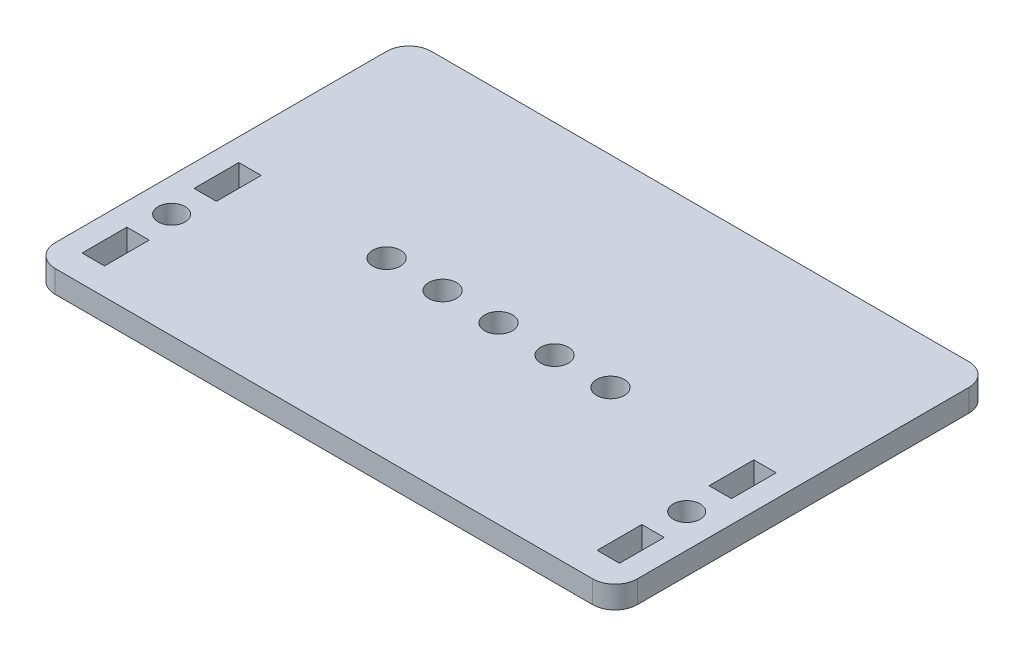
ISO-10303-21;
HEADER;
FILE_DESCRIPTION(('STEP AP214'),'2;1');
FILE_NAME('part.step','',(''),(''),'','','');
FILE_SCHEMA(('AUTOMOTIVE_DESIGN { 1 0 10303 214 1 1 1 1 }'));
ENDSEC;
DATA;
#1=APPLICATION_CONTEXT('core data for automotive mechanical design processes');
#2=APPLICATION_PROTOCOL_DEFINITION('international standard','automotive_design',2000,#1);
#3=PRODUCT_CONTEXT('',#1,'mechanical');
#4=PRODUCT('Part','Part','',(#3));
#5=PRODUCT_RELATED_PRODUCT_CATEGORY('part','',(#4));
#6=PRODUCT_DEFINITION_FORMATION('','',#4);
#7=PRODUCT_DEFINITION_CONTEXT('part definition',#1,'design');
#8=PRODUCT_DEFINITION('design','',#6,#7);
#9=PRODUCT_DEFINITION_SHAPE('','',#8);
#10=(LENGTH_UNIT() NAMED_UNIT(*) SI_UNIT(.MILLI.,.METRE.));
#11=(NAMED_UNIT(*) PLANE_ANGLE_UNIT() SI_UNIT($,.RADIAN.));
#12=(NAMED_UNIT(*) SI_UNIT($,.STERADIAN.) SOLID_ANGLE_UNIT());
#13=UNCERTAINTY_MEASURE_WITH_UNIT(LENGTH_MEASURE(1.E-05),#10,'distance_accuracy_value','');
#14=(GEOMETRIC_REPRESENTATION_CONTEXT(3) GLOBAL_UNCERTAINTY_ASSIGNED_CONTEXT((#13)) GLOBAL_UNIT_ASSIGNED_CONTEXT((#10,
#11,#12)) REPRESENTATION_CONTEXT('',''));
#15=CARTESIAN_POINT('',(0.,0.,0.));
#16=DIRECTION('',(0.,0.,1.));
#17=DIRECTION('',(1.,0.,0.));
#18=AXIS2_PLACEMENT_3D('',#15,#16,#17);
#19=CARTESIAN_POINT('',(65.,5.,-26.));
#20=DIRECTION('',(-1.,0.,0.));
#21=DIRECTION('',(0.,0.,1.));
#22=AXIS2_PLACEMENT_3D('',#19,#20,#21);
#23=PLANE('',#22);
#24=DIRECTION('',(0.,0.,-1.));
#25=VECTOR('',#24,1.);
#26=CARTESIAN_POINT('',(65.,0.,-26.));
#27=LINE('',#26,#25);
#28=CARTESIAN_POINT('',(65.,0.,21.));
#29=VERTEX_POINT('',#28);
#30=CARTESIAN_POINT('',(65.,0.,-53.));
#31=VERTEX_POINT('',#30);
#32=EDGE_CURVE('E306',#29,#31,#27,.T.);
#33=ORIENTED_EDGE('',*,*,#32,.T.);
#34=DIRECTION('',(0.,-1.,0.));
#35=VECTOR('',#34,1.);
#36=CARTESIAN_POINT('',(65.,5.,-53.));
#37=LINE('',#36,#35);
#38=CARTESIAN_POINT('',(65.,5.,-53.));
#39=VERTEX_POINT('',#38);
#40=EDGE_CURVE('E387',#31,#39,#37,.F.);
#41=ORIENTED_EDGE('',*,*,#40,.T.);
#42=DIRECTION('',(0.,0.,-1.));
#43=VECTOR('',#42,1.);
#44=CARTESIAN_POINT('',(65.,5.,-26.));
#45=LINE('',#44,#43);
#46=CARTESIAN_POINT('',(65.,5.,21.));
#47=VERTEX_POINT('',#46);
#48=EDGE_CURVE('E307',#47,#39,#45,.T.);
#49=ORIENTED_EDGE('',*,*,#48,.F.);
#50=DIRECTION('',(0.,-1.,0.));
#51=VECTOR('',#50,1.);
#52=CARTESIAN_POINT('',(65.,5.,21.));
#53=LINE('',#52,#51);
#54=EDGE_CURVE('E384',#47,#29,#53,.T.);
#55=ORIENTED_EDGE('',*,*,#54,.T.);
#56=EDGE_LOOP('',(#33,#41,#49,#55));
#57=FACE_BOUND('',#56,.T.);
#58=ADVANCED_FACE('F35',(#57),#23,.F.);
#59=CARTESIAN_POINT('',(-65.,5.,-26.));
#60=DIRECTION('',(1.,0.,0.));
#61=DIRECTION('',(0.,0.,-1.));
#62=AXIS2_PLACEMENT_3D('',#59,#60,#61);
#63=PLANE('',#62);
#64=DIRECTION('',(0.,0.,1.));
#65=VECTOR('',#64,1.);
#66=CARTESIAN_POINT('',(-65.,0.,-26.));
#67=LINE('',#66,#65);
#68=CARTESIAN_POINT('',(-65.,0.,-53.));
#69=VERTEX_POINT('',#68);
#70=CARTESIAN_POINT('',(-65.,0.,21.));
#71=VERTEX_POINT('',#70);
#72=EDGE_CURVE('E318',#69,#71,#67,.T.);
#73=ORIENTED_EDGE('',*,*,#72,.T.);
#74=DIRECTION('',(0.,-1.,0.));
#75=VECTOR('',#74,1.);
#76=CARTESIAN_POINT('',(-65.,5.,21.));
#77=LINE('',#76,#75);
#78=CARTESIAN_POINT('',(-65.,5.,21.));
#79=VERTEX_POINT('',#78);
#80=EDGE_CURVE('E11',#71,#79,#77,.F.);
#81=ORIENTED_EDGE('',*,*,#80,.T.);
#82=DIRECTION('',(0.,0.,1.));
#83=VECTOR('',#82,1.);
#84=CARTESIAN_POINT('',(-65.,5.,-26.));
#85=LINE('',#84,#83);
#86=CARTESIAN_POINT('',(-65.,5.,-53.));
#87=VERTEX_POINT('',#86);
#88=EDGE_CURVE('E310',#87,#79,#85,.T.);
#89=ORIENTED_EDGE('',*,*,#88,.F.);
#90=DIRECTION('',(0.,1.,0.));
#91=VECTOR('',#90,1.);
#92=CARTESIAN_POINT('',(-65.,0.,-53.));
#93=LINE('',#92,#91);
#94=EDGE_CURVE('E43',#87,#69,#93,.F.);
#95=ORIENTED_EDGE('',*,*,#94,.T.);
#96=EDGE_LOOP('',(#73,#81,#89,#95));
#97=FACE_BOUND('',#96,.T.);
#98=ADVANCED_FACE('F403',(#97),#63,.F.);
#99=CARTESIAN_POINT('',(-65.,5.,26.));
#100=DIRECTION('',(0.,0.,-1.));
#101=DIRECTION('',(-1.,0.,0.));
#102=AXIS2_PLACEMENT_3D('',#99,#100,#101);
#103=PLANE('',#102);
#104=DIRECTION('',(1.,0.,0.));
#105=VECTOR('',#104,1.);
#106=CARTESIAN_POINT('',(-65.,5.,26.));
#107=LINE('',#106,#105);
#108=CARTESIAN_POINT('',(-60.,5.,26.));
#109=VERTEX_POINT('',#108);
#110=CARTESIAN_POINT('',(60.,5.,26.));
#111=VERTEX_POINT('',#110);
#112=EDGE_CURVE('E313',#109,#111,#107,.T.);
#113=ORIENTED_EDGE('',*,*,#112,.F.);
#114=DIRECTION('',(0.,-1.,0.));
#115=VECTOR('',#114,1.);
#116=CARTESIAN_POINT('',(-60.,5.,26.));
#117=LINE('',#116,#115);
#118=CARTESIAN_POINT('',(-60.,0.,26.));
#119=VERTEX_POINT('',#118);
#120=EDGE_CURVE('E397',#109,#119,#117,.T.);
#121=ORIENTED_EDGE('',*,*,#120,.T.);
#122=DIRECTION('',(1.,0.,0.));
#123=VECTOR('',#122,1.);
#124=CARTESIAN_POINT('',(-65.,0.,26.));
#125=LINE('',#124,#123);
#126=CARTESIAN_POINT('',(60.,0.,26.));
#127=VERTEX_POINT('',#126);
#128=EDGE_CURVE('E311',#119,#127,#125,.T.);
#129=ORIENTED_EDGE('',*,*,#128,.T.);
#130=DIRECTION('',(0.,-1.,0.));
#131=VECTOR('',#130,1.);
#132=CARTESIAN_POINT('',(60.,5.,26.));
#133=LINE('',#132,#131);
#134=EDGE_CURVE('E50',#127,#111,#133,.F.);
#135=ORIENTED_EDGE('',*,*,#134,.T.);
#136=EDGE_LOOP('',(#113,#121,#129,#135));
#137=FACE_BOUND('',#136,.T.);
#138=ADVANCED_FACE('F427',(#137),#103,.F.);
#139=CARTESIAN_POINT('',(0.,5.,0.));
#140=DIRECTION('',(0.,1.,0.));
#141=DIRECTION('',(0.,0.,1.));
#142=AXIS2_PLACEMENT_3D('',#139,#140,#141);
#143=PLANE('',#142);
#144=CARTESIAN_POINT('',(25.,5.,-13.));
#145=DIRECTION('',(0.,1.,0.));
#146=DIRECTION('',(0.,0.,-1.));
#147=AXIS2_PLACEMENT_3D('',#144,#145,#146);
#148=CIRCLE('',#147,3.09999999999999);
#149=CARTESIAN_POINT('',(25.,5.,-16.1));
#150=VERTEX_POINT('',#149);
#151=EDGE_CURVE('E547',#150,#150,#148,.T.);
#152=ORIENTED_EDGE('',*,*,#151,.F.);
#153=EDGE_LOOP('',(#152));
#154=FACE_BOUND('',#153,.T.);
#155=CARTESIAN_POINT('',(12.5,5.,-13.));
#156=DIRECTION('',(0.,1.,0.));
#157=DIRECTION('',(0.,0.,-1.));
#158=AXIS2_PLACEMENT_3D('',#155,#156,#157);
#159=CIRCLE('',#158,3.1);
#160=CARTESIAN_POINT('',(12.5,5.,-16.1));
#161=VERTEX_POINT('',#160);
#162=EDGE_CURVE('E551',#161,#161,#159,.T.);
#163=ORIENTED_EDGE('',*,*,#162,.F.);
#164=EDGE_LOOP('',(#163));
#165=FACE_BOUND('',#164,.T.);
#166=CARTESIAN_POINT('',(0.,5.,-13.));
#167=DIRECTION('',(0.,1.,0.));
#168=DIRECTION('',(0.,0.,1.));
#169=AXIS2_PLACEMENT_3D('',#166,#167,#168);
#170=CIRCLE('',#169,3.1);
#171=CARTESIAN_POINT('',(0.,5.,-9.9));
#172=VERTEX_POINT('',#171);
#173=EDGE_CURVE('E560',#172,#172,#170,.T.);
#174=ORIENTED_EDGE('',*,*,#173,.F.);
#175=EDGE_LOOP('',(#174));
#176=FACE_BOUND('',#175,.T.);
#177=CARTESIAN_POINT('',(-25.,5.,-13.));
#178=DIRECTION('',(0.,1.,0.));
#179=DIRECTION('',(0.,0.,1.));
#180=AXIS2_PLACEMENT_3D('',#177,#178,#179);
#181=CIRCLE('',#180,3.1);
#182=CARTESIAN_POINT('',(-25.,5.,-9.9));
#183=VERTEX_POINT('',#182);
#184=EDGE_CURVE('E566',#183,#183,#181,.T.);
#185=ORIENTED_EDGE('',*,*,#184,.F.);
#186=EDGE_LOOP('',(#185));
#187=FACE_BOUND('',#186,.T.);
#188=CARTESIAN_POINT('',(-12.5,5.,-13.));
#189=DIRECTION('',(0.,1.,0.));
#190=DIRECTION('',(0.,0.,1.));
#191=AXIS2_PLACEMENT_3D('',#188,#189,#190);
#192=CIRCLE('',#191,3.1);
#193=CARTESIAN_POINT('',(-12.5,5.,-9.9));
#194=VERTEX_POINT('',#193);
#195=EDGE_CURVE('E572',#194,#194,#192,.T.);
#196=ORIENTED_EDGE('',*,*,#195,.F.);
#197=EDGE_LOOP('',(#196));
#198=FACE_BOUND('',#197,.T.);
#199=DIRECTION('',(-1.,0.,0.));
#200=VECTOR('',#199,1.);
#201=CARTESIAN_POINT('',(60.,5.,10.));
#202=LINE('',#201,#200);
#203=CARTESIAN_POINT('',(60.,5.,10.));
#204=VERTEX_POINT('',#203);
#205=CARTESIAN_POINT('',(55.,5.,10.));
#206=VERTEX_POINT('',#205);
#207=EDGE_CURVE('E218',#204,#206,#202,.T.);
#208=ORIENTED_EDGE('',*,*,#207,.F.);
#209=DIRECTION('',(0.,0.,-1.));
#210=VECTOR('',#209,1.);
#211=CARTESIAN_POINT('',(60.,5.,10.));
#212=LINE('',#211,#210);
#213=CARTESIAN_POINT('',(60.,5.,20.));
#214=VERTEX_POINT('',#213);
#215=EDGE_CURVE('E223',#214,#204,#212,.T.);
#216=ORIENTED_EDGE('',*,*,#215,.F.);
#217=DIRECTION('',(1.,0.,0.));
#218=VECTOR('',#217,1.);
#219=CARTESIAN_POINT('',(60.,5.,20.));
#220=LINE('',#219,#218);
#221=CARTESIAN_POINT('',(55.,5.,20.));
#222=VERTEX_POINT('',#221);
#223=EDGE_CURVE('E202',#222,#214,#220,.T.);
#224=ORIENTED_EDGE('',*,*,#223,.F.);
#225=DIRECTION('',(0.,0.,1.));
#226=VECTOR('',#225,1.);
#227=CARTESIAN_POINT('',(55.,5.,10.));
#228=LINE('',#227,#226);
#229=EDGE_CURVE('E213',#206,#222,#228,.T.);
#230=ORIENTED_EDGE('',*,*,#229,.F.);
#231=EDGE_LOOP('',(#208,#216,#224,#230));
#232=FACE_BOUND('',#231,.T.);
#233=DIRECTION('',(-1.,0.,0.));
#234=VECTOR('',#233,1.);
#235=CARTESIAN_POINT('',(60.,5.,-15.));
#236=LINE('',#235,#234);
#237=CARTESIAN_POINT('',(60.,5.,-15.));
#238=VERTEX_POINT('',#237);
#239=CARTESIAN_POINT('',(55.,5.,-15.));
#240=VERTEX_POINT('',#239);
#241=EDGE_CURVE('E230',#238,#240,#236,.T.);
#242=ORIENTED_EDGE('',*,*,#241,.F.);
#243=DIRECTION('',(0.,0.,-1.));
#244=VECTOR('',#243,1.);
#245=CARTESIAN_POINT('',(60.,5.,-15.));
#246=LINE('',#245,#244);
#247=CARTESIAN_POINT('',(60.,5.,-5.));
#248=VERTEX_POINT('',#247);
#249=EDGE_CURVE('E240',#248,#238,#246,.T.);
#250=ORIENTED_EDGE('',*,*,#249,.F.);
#251=DIRECTION('',(1.,0.,0.));
#252=VECTOR('',#251,1.);
#253=CARTESIAN_POINT('',(60.,5.,-5.));
#254=LINE('',#253,#252);
#255=CARTESIAN_POINT('',(55.,5.,-5.));
#256=VERTEX_POINT('',#255);
#257=EDGE_CURVE('E237',#256,#248,#254,.T.);
#258=ORIENTED_EDGE('',*,*,#257,.F.);
#259=DIRECTION('',(0.,0.,1.));
#260=VECTOR('',#259,1.);
#261=CARTESIAN_POINT('',(55.,5.,-15.));
#262=LINE('',#261,#260);
#263=EDGE_CURVE('E234',#240,#256,#262,.T.);
#264=ORIENTED_EDGE('',*,*,#263,.F.);
#265=EDGE_LOOP('',(#242,#250,#258,#264));
#266=FACE_BOUND('',#265,.T.);
#267=CARTESIAN_POINT('',(57.5,5.,2.5));
#268=DIRECTION('',(0.,1.,0.));
#269=DIRECTION('',(0.,0.,-1.));
#270=AXIS2_PLACEMENT_3D('',#267,#268,#269);
#271=CIRCLE('',#270,3.);
#272=CARTESIAN_POINT('',(57.5,5.,-0.500000000000003));
#273=VERTEX_POINT('',#272);
#274=EDGE_CURVE('E246',#273,#273,#271,.T.);
#275=ORIENTED_EDGE('',*,*,#274,.F.);
#276=EDGE_LOOP('',(#275));
#277=FACE_BOUND('',#276,.T.);
#278=CARTESIAN_POINT('',(-57.5,5.,2.5));
#279=DIRECTION('',(0.,1.,0.));
#280=DIRECTION('',(0.,0.,1.));
#281=AXIS2_PLACEMENT_3D('',#278,#279,#280);
#282=CIRCLE('',#281,3.);
#283=CARTESIAN_POINT('',(-57.5,5.,5.5));
#284=VERTEX_POINT('',#283);
#285=EDGE_CURVE('E256',#284,#284,#282,.T.);
#286=ORIENTED_EDGE('',*,*,#285,.F.);
#287=EDGE_LOOP('',(#286));
#288=FACE_BOUND('',#287,.T.);
#289=DIRECTION('',(0.,0.,1.));
#290=VECTOR('',#289,1.);
#291=CARTESIAN_POINT('',(-60.,5.,-15.));
#292=LINE('',#291,#290);
#293=CARTESIAN_POINT('',(-60.,5.,-15.));
#294=VERTEX_POINT('',#293);
#295=CARTESIAN_POINT('',(-60.,5.,-5.));
#296=VERTEX_POINT('',#295);
#297=EDGE_CURVE('E260',#294,#296,#292,.T.);
#298=ORIENTED_EDGE('',*,*,#297,.F.);
#299=DIRECTION('',(-1.,0.,0.));
#300=VECTOR('',#299,1.);
#301=CARTESIAN_POINT('',(-60.,5.,-15.));
#302=LINE('',#301,#300);
#303=CARTESIAN_POINT('',(-55.,5.,-15.));
#304=VERTEX_POINT('',#303);
#305=EDGE_CURVE('E268',#304,#294,#302,.T.);
#306=ORIENTED_EDGE('',*,*,#305,.F.);
#307=DIRECTION('',(0.,0.,-1.));
#308=VECTOR('',#307,1.);
#309=CARTESIAN_POINT('',(-55.,5.,-15.));
#310=LINE('',#309,#308);
#311=CARTESIAN_POINT('',(-55.,5.,-5.));
#312=VERTEX_POINT('',#311);
#313=EDGE_CURVE('E265',#312,#304,#310,.T.);
#314=ORIENTED_EDGE('',*,*,#313,.F.);
#315=DIRECTION('',(1.,0.,0.));
#316=VECTOR('',#315,1.);
#317=CARTESIAN_POINT('',(-60.,5.,-5.));
#318=LINE('',#317,#316);
#319=EDGE_CURVE('E262',#296,#312,#318,.T.);
#320=ORIENTED_EDGE('',*,*,#319,.F.);
#321=EDGE_LOOP('',(#298,#306,#314,#320));
#322=FACE_BOUND('',#321,.T.);
#323=DIRECTION('',(0.,0.,1.));
#324=VECTOR('',#323,1.);
#325=CARTESIAN_POINT('',(-60.,5.,10.));
#326=LINE('',#325,#324);
#327=CARTESIAN_POINT('',(-60.,5.,10.));
#328=VERTEX_POINT('',#327);
#329=CARTESIAN_POINT('',(-60.,5.,20.));
#330=VERTEX_POINT('',#329);
#331=EDGE_CURVE('E274',#328,#330,#326,.T.);
#332=ORIENTED_EDGE('',*,*,#331,.F.);
#333=DIRECTION('',(-1.,0.,0.));
#334=VECTOR('',#333,1.);
#335=CARTESIAN_POINT('',(-60.,5.,10.));
#336=LINE('',#335,#334);
#337=CARTESIAN_POINT('',(-55.,5.,10.));
#338=VERTEX_POINT('',#337);
#339=EDGE_CURVE('E288',#338,#328,#336,.T.);
#340=ORIENTED_EDGE('',*,*,#339,.F.);
#341=DIRECTION('',(0.,0.,-1.));
#342=VECTOR('',#341,1.);
#343=CARTESIAN_POINT('',(-55.,5.,10.));
#344=LINE('',#343,#342);
#345=CARTESIAN_POINT('',(-55.,5.,20.));
#346=VERTEX_POINT('',#345);
#347=EDGE_CURVE('E285',#346,#338,#344,.T.);
#348=ORIENTED_EDGE('',*,*,#347,.F.);
#349=DIRECTION('',(1.,0.,0.));
#350=VECTOR('',#349,1.);
#351=CARTESIAN_POINT('',(-60.,5.,20.));
#352=LINE('',#351,#350);
#353=EDGE_CURVE('E282',#330,#346,#352,.T.);
#354=ORIENTED_EDGE('',*,*,#353,.F.);
#355=EDGE_LOOP('',(#332,#340,#348,#354));
#356=FACE_BOUND('',#355,.T.);
#357=ORIENTED_EDGE('',*,*,#48,.T.);
#358=CARTESIAN_POINT('',(60.,5.,-53.));
#359=DIRECTION('',(0.,1.,0.));
#360=DIRECTION('',(0.,0.,1.));
#361=AXIS2_PLACEMENT_3D('',#358,#359,#360);
#362=CIRCLE('',#361,5.);
#363=CARTESIAN_POINT('',(60.,5.,-58.));
#364=VERTEX_POINT('',#363);
#365=EDGE_CURVE('E394',#39,#364,#362,.T.);
#366=ORIENTED_EDGE('',*,*,#365,.T.);
#367=DIRECTION('',(1.,0.,0.));
#368=VECTOR('',#367,1.);
#369=CARTESIAN_POINT('',(-65.,5.,-58.));
#370=LINE('',#369,#368);
#371=CARTESIAN_POINT('',(-60.,5.,-58.));
#372=VERTEX_POINT('',#371);
#373=EDGE_CURVE('E303',#372,#364,#370,.T.);
#374=ORIENTED_EDGE('',*,*,#373,.F.);
#375=CARTESIAN_POINT('',(-60.,5.,-53.));
#376=DIRECTION('',(0.,1.,0.));
#377=DIRECTION('',(0.,0.,1.));
#378=AXIS2_PLACEMENT_3D('',#375,#376,#377);
#379=CIRCLE('',#378,5.);
#380=EDGE_CURVE('E389',#372,#87,#379,.T.);
#381=ORIENTED_EDGE('',*,*,#380,.T.);
#382=ORIENTED_EDGE('',*,*,#88,.T.);
#383=CARTESIAN_POINT('',(-60.,5.,21.));
#384=DIRECTION('',(0.,1.,0.));
#385=DIRECTION('',(0.,0.,1.));
#386=AXIS2_PLACEMENT_3D('',#383,#384,#385);
#387=CIRCLE('',#386,5.);
#388=EDGE_CURVE('E57',#79,#109,#387,.T.);
#389=ORIENTED_EDGE('',*,*,#388,.T.);
#390=ORIENTED_EDGE('',*,*,#112,.T.);
#391=CARTESIAN_POINT('',(60.,5.,21.));
#392=DIRECTION('',(0.,1.,0.));
#393=DIRECTION('',(0.,0.,1.));
#394=AXIS2_PLACEMENT_3D('',#391,#392,#393);
#395=CIRCLE('',#394,5.);
#396=EDGE_CURVE('E391',#111,#47,#395,.T.);
#397=ORIENTED_EDGE('',*,*,#396,.T.);
#398=EDGE_LOOP('',(#357,#366,#374,#381,#382,#389,#390,#397));
#399=FACE_BOUND('',#398,.T.);
#400=ADVANCED_FACE('F220',(#154,#165,#176,#187,#198,#232,#266,#277,#288,#322,#356,#399),#143,.T.);
#401=CARTESIAN_POINT('',(0.,0.,0.));
#402=DIRECTION('',(0.,1.,0.));
#403=DIRECTION('',(0.,0.,1.));
#404=AXIS2_PLACEMENT_3D('',#401,#402,#403);
#405=PLANE('',#404);
#406=CARTESIAN_POINT('',(25.,0.,-13.));
#407=DIRECTION('',(0.,1.,0.));
#408=DIRECTION('',(0.,0.,1.));
#409=AXIS2_PLACEMENT_3D('',#406,#407,#408);
#410=CIRCLE('',#409,3.09999999999999);
#411=CARTESIAN_POINT('',(25.,0.,-9.90000000000001));
#412=VERTEX_POINT('',#411);
#413=EDGE_CURVE('E550',#412,#412,#410,.F.);
#414=ORIENTED_EDGE('',*,*,#413,.F.);
#415=EDGE_LOOP('',(#414));
#416=FACE_BOUND('',#415,.T.);
#417=CARTESIAN_POINT('',(12.5,0.,-13.));
#418=DIRECTION('',(0.,1.,0.));
#419=DIRECTION('',(0.,0.,1.));
#420=AXIS2_PLACEMENT_3D('',#417,#418,#419);
#421=CIRCLE('',#420,3.1);
#422=CARTESIAN_POINT('',(12.5,0.,-9.9));
#423=VERTEX_POINT('',#422);
#424=EDGE_CURVE('E554',#423,#423,#421,.F.);
#425=ORIENTED_EDGE('',*,*,#424,.F.);
#426=EDGE_LOOP('',(#425));
#427=FACE_BOUND('',#426,.T.);
#428=CARTESIAN_POINT('',(0.,0.,-13.));
#429=DIRECTION('',(0.,1.,0.));
#430=DIRECTION('',(0.,0.,1.));
#431=AXIS2_PLACEMENT_3D('',#428,#429,#430);
#432=CIRCLE('',#431,3.1);
#433=CARTESIAN_POINT('',(0.,0.,-9.9));
#434=VERTEX_POINT('',#433);
#435=EDGE_CURVE('E563',#434,#434,#432,.F.);
#436=ORIENTED_EDGE('',*,*,#435,.F.);
#437=EDGE_LOOP('',(#436));
#438=FACE_BOUND('',#437,.T.);
#439=CARTESIAN_POINT('',(-25.,0.,-13.));
#440=DIRECTION('',(0.,1.,0.));
#441=DIRECTION('',(0.,0.,1.));
#442=AXIS2_PLACEMENT_3D('',#439,#440,#441);
#443=CIRCLE('',#442,3.1);
#444=CARTESIAN_POINT('',(-25.,0.,-9.9));
#445=VERTEX_POINT('',#444);
#446=EDGE_CURVE('E569',#445,#445,#443,.F.);
#447=ORIENTED_EDGE('',*,*,#446,.F.);
#448=EDGE_LOOP('',(#447));
#449=FACE_BOUND('',#448,.T.);
#450=CARTESIAN_POINT('',(-12.5,0.,-13.));
#451=DIRECTION('',(0.,1.,0.));
#452=DIRECTION('',(0.,0.,1.));
#453=AXIS2_PLACEMENT_3D('',#450,#451,#452);
#454=CIRCLE('',#453,3.1);
#455=CARTESIAN_POINT('',(-12.5,0.,-9.9));
#456=VERTEX_POINT('',#455);
#457=EDGE_CURVE('E575',#456,#456,#454,.F.);
#458=ORIENTED_EDGE('',*,*,#457,.F.);
#459=EDGE_LOOP('',(#458));
#460=FACE_BOUND('',#459,.T.);
#461=DIRECTION('',(0.,0.,-1.));
#462=VECTOR('',#461,1.);
#463=CARTESIAN_POINT('',(60.,0.,0.));
#464=LINE('',#463,#462);
#465=CARTESIAN_POINT('',(60.,0.,20.));
#466=VERTEX_POINT('',#465);
#467=CARTESIAN_POINT('',(60.,0.,10.));
#468=VERTEX_POINT('',#467);
#469=EDGE_CURVE('E364',#466,#468,#464,.T.);
#470=ORIENTED_EDGE('',*,*,#469,.T.);
#471=DIRECTION('',(-1.,0.,0.));
#472=VECTOR('',#471,1.);
#473=CARTESIAN_POINT('',(0.,0.,10.));
#474=LINE('',#473,#472);
#475=CARTESIAN_POINT('',(55.,0.,10.));
#476=VERTEX_POINT('',#475);
#477=EDGE_CURVE('E367',#468,#476,#474,.T.);
#478=ORIENTED_EDGE('',*,*,#477,.T.);
#479=DIRECTION('',(0.,0.,1.));
#480=VECTOR('',#479,1.);
#481=CARTESIAN_POINT('',(55.,0.,0.));
#482=LINE('',#481,#480);
#483=CARTESIAN_POINT('',(55.,0.,20.));
#484=VERTEX_POINT('',#483);
#485=EDGE_CURVE('E361',#476,#484,#482,.T.);
#486=ORIENTED_EDGE('',*,*,#485,.T.);
#487=DIRECTION('',(1.,0.,0.));
#488=VECTOR('',#487,1.);
#489=CARTESIAN_POINT('',(0.,0.,20.));
#490=LINE('',#489,#488);
#491=EDGE_CURVE('E205',#484,#466,#490,.T.);
#492=ORIENTED_EDGE('',*,*,#491,.T.);
#493=EDGE_LOOP('',(#470,#478,#486,#492));
#494=FACE_BOUND('',#493,.T.);
#495=DIRECTION('',(0.,0.,-1.));
#496=VECTOR('',#495,1.);
#497=CARTESIAN_POINT('',(60.,0.,0.));
#498=LINE('',#497,#496);
#499=CARTESIAN_POINT('',(60.,0.,-5.));
#500=VERTEX_POINT('',#499);
#501=CARTESIAN_POINT('',(60.,0.,-15.));
#502=VERTEX_POINT('',#501);
#503=EDGE_CURVE('E355',#500,#502,#498,.T.);
#504=ORIENTED_EDGE('',*,*,#503,.T.);
#505=DIRECTION('',(-1.,0.,0.));
#506=VECTOR('',#505,1.);
#507=CARTESIAN_POINT('',(0.,0.,-15.));
#508=LINE('',#507,#506);
#509=CARTESIAN_POINT('',(55.,0.,-15.));
#510=VERTEX_POINT('',#509);
#511=EDGE_CURVE('E358',#502,#510,#508,.T.);
#512=ORIENTED_EDGE('',*,*,#511,.T.);
#513=DIRECTION('',(0.,0.,1.));
#514=VECTOR('',#513,1.);
#515=CARTESIAN_POINT('',(55.,0.,0.));
#516=LINE('',#515,#514);
#517=CARTESIAN_POINT('',(55.,0.,-5.));
#518=VERTEX_POINT('',#517);
#519=EDGE_CURVE('E345',#510,#518,#516,.T.);
#520=ORIENTED_EDGE('',*,*,#519,.T.);
#521=DIRECTION('',(1.,0.,0.));
#522=VECTOR('',#521,1.);
#523=CARTESIAN_POINT('',(0.,0.,-5.00000000000002));
#524=LINE('',#523,#522);
#525=EDGE_CURVE('E352',#518,#500,#524,.T.);
#526=ORIENTED_EDGE('',*,*,#525,.T.);
#527=EDGE_LOOP('',(#504,#512,#520,#526));
#528=FACE_BOUND('',#527,.T.);
#529=CARTESIAN_POINT('',(57.5,0.,2.5));
#530=DIRECTION('',(0.,1.,0.));
#531=DIRECTION('',(0.,0.,1.));
#532=AXIS2_PLACEMENT_3D('',#529,#530,#531);
#533=CIRCLE('',#532,3.);
#534=CARTESIAN_POINT('',(57.5,0.,5.5));
#535=VERTEX_POINT('',#534);
#536=EDGE_CURVE('E255',#535,#535,#533,.T.);
#537=ORIENTED_EDGE('',*,*,#536,.T.);
#538=EDGE_LOOP('',(#537));
#539=FACE_BOUND('',#538,.T.);
#540=CARTESIAN_POINT('',(-57.5,0.,2.5));
#541=DIRECTION('',(0.,1.,0.));
#542=DIRECTION('',(0.,0.,1.));
#543=AXIS2_PLACEMENT_3D('',#540,#541,#542);
#544=CIRCLE('',#543,3.);
#545=CARTESIAN_POINT('',(-57.5,0.,5.5));
#546=VERTEX_POINT('',#545);
#547=EDGE_CURVE('E259',#546,#546,#544,.T.);
#548=ORIENTED_EDGE('',*,*,#547,.T.);
#549=EDGE_LOOP('',(#548));
#550=FACE_BOUND('',#549,.T.);
#551=DIRECTION('',(-1.,0.,0.));
#552=VECTOR('',#551,1.);
#553=CARTESIAN_POINT('',(0.,0.,-15.));
#554=LINE('',#553,#552);
#555=CARTESIAN_POINT('',(-55.,0.,-15.));
#556=VERTEX_POINT('',#555);
#557=CARTESIAN_POINT('',(-60.,0.,-15.));
#558=VERTEX_POINT('',#557);
#559=EDGE_CURVE('E339',#556,#558,#554,.T.);
#560=ORIENTED_EDGE('',*,*,#559,.T.);
#561=DIRECTION('',(0.,0.,1.));
#562=VECTOR('',#561,1.);
#563=CARTESIAN_POINT('',(-60.,0.,0.));
#564=LINE('',#563,#562);
#565=CARTESIAN_POINT('',(-60.,0.,-5.));
#566=VERTEX_POINT('',#565);
#567=EDGE_CURVE('E342',#558,#566,#564,.T.);
#568=ORIENTED_EDGE('',*,*,#567,.T.);
#569=DIRECTION('',(1.,0.,0.));
#570=VECTOR('',#569,1.);
#571=CARTESIAN_POINT('',(0.,0.,-5.));
#572=LINE('',#571,#570);
#573=CARTESIAN_POINT('',(-55.,0.,-5.));
#574=VERTEX_POINT('',#573);
#575=EDGE_CURVE('E333',#566,#574,#572,.T.);
#576=ORIENTED_EDGE('',*,*,#575,.T.);
#577=DIRECTION('',(0.,0.,-1.));
#578=VECTOR('',#577,1.);
#579=CARTESIAN_POINT('',(-55.,0.,0.));
#580=LINE('',#579,#578);
#581=EDGE_CURVE('E336',#574,#556,#580,.T.);
#582=ORIENTED_EDGE('',*,*,#581,.T.);
#583=EDGE_LOOP('',(#560,#568,#576,#582));
#584=FACE_BOUND('',#583,.T.);
#585=DIRECTION('',(-1.,0.,0.));
#586=VECTOR('',#585,1.);
#587=CARTESIAN_POINT('',(0.,0.,10.));
#588=LINE('',#587,#586);
#589=CARTESIAN_POINT('',(-55.,0.,10.));
#590=VERTEX_POINT('',#589);
#591=CARTESIAN_POINT('',(-60.,0.,10.));
#592=VERTEX_POINT('',#591);
#593=EDGE_CURVE('E327',#590,#592,#588,.T.);
#594=ORIENTED_EDGE('',*,*,#593,.T.);
#595=DIRECTION('',(0.,0.,1.));
#596=VECTOR('',#595,1.);
#597=CARTESIAN_POINT('',(-60.,0.,0.));
#598=LINE('',#597,#596);
#599=CARTESIAN_POINT('',(-60.,0.,20.));
#600=VERTEX_POINT('',#599);
#601=EDGE_CURVE('E330',#592,#600,#598,.T.);
#602=ORIENTED_EDGE('',*,*,#601,.T.);
#603=DIRECTION('',(1.,0.,0.));
#604=VECTOR('',#603,1.);
#605=CARTESIAN_POINT('',(0.,0.,20.));
#606=LINE('',#605,#604);
#607=CARTESIAN_POINT('',(-55.,0.,20.));
#608=VERTEX_POINT('',#607);
#609=EDGE_CURVE('E315',#600,#608,#606,.T.);
#610=ORIENTED_EDGE('',*,*,#609,.T.);
#611=DIRECTION('',(0.,0.,-1.));
#612=VECTOR('',#611,1.);
#613=CARTESIAN_POINT('',(-55.,0.,0.));
#614=LINE('',#613,#612);
#615=EDGE_CURVE('E324',#608,#590,#614,.T.);
#616=ORIENTED_EDGE('',*,*,#615,.T.);
#617=EDGE_LOOP('',(#594,#602,#610,#616));
#618=FACE_BOUND('',#617,.T.);
#619=DIRECTION('',(-1.,0.,0.));
#620=VECTOR('',#619,1.);
#621=CARTESIAN_POINT('',(65.,0.,-58.));
#622=LINE('',#621,#620);
#623=CARTESIAN_POINT('',(60.,0.,-58.));
#624=VERTEX_POINT('',#623);
#625=CARTESIAN_POINT('',(-60.,0.,-58.));
#626=VERTEX_POINT('',#625);
#627=EDGE_CURVE('E294',#624,#626,#622,.T.);
#628=ORIENTED_EDGE('',*,*,#627,.F.);
#629=CARTESIAN_POINT('',(60.,0.,-53.));
#630=DIRECTION('',(0.,1.,0.));
#631=DIRECTION('',(0.,0.,1.));
#632=AXIS2_PLACEMENT_3D('',#629,#630,#631);
#633=CIRCLE('',#632,5.);
#634=EDGE_CURVE('E382',#624,#31,#633,.F.);
#635=ORIENTED_EDGE('',*,*,#634,.T.);
#636=ORIENTED_EDGE('',*,*,#32,.F.);
#637=CARTESIAN_POINT('',(60.,0.,21.));
#638=DIRECTION('',(0.,1.,0.));
#639=DIRECTION('',(0.,0.,1.));
#640=AXIS2_PLACEMENT_3D('',#637,#638,#639);
#641=CIRCLE('',#640,5.);
#642=EDGE_CURVE('E378',#29,#127,#641,.F.);
#643=ORIENTED_EDGE('',*,*,#642,.T.);
#644=ORIENTED_EDGE('',*,*,#128,.F.);
#645=CARTESIAN_POINT('',(-60.,0.,21.));
#646=DIRECTION('',(0.,1.,0.));
#647=DIRECTION('',(0.,0.,1.));
#648=AXIS2_PLACEMENT_3D('',#645,#646,#647);
#649=CIRCLE('',#648,5.);
#650=EDGE_CURVE('E380',#119,#71,#649,.F.);
#651=ORIENTED_EDGE('',*,*,#650,.T.);
#652=ORIENTED_EDGE('',*,*,#72,.F.);
#653=CARTESIAN_POINT('',(-60.,0.,-53.));
#654=DIRECTION('',(0.,1.,0.));
#655=DIRECTION('',(0.,0.,1.));
#656=AXIS2_PLACEMENT_3D('',#653,#654,#655);
#657=CIRCLE('',#656,5.);
#658=EDGE_CURVE('E376',#69,#626,#657,.F.);
#659=ORIENTED_EDGE('',*,*,#658,.T.);
#660=EDGE_LOOP('',(#628,#635,#636,#643,#644,#651,#652,#659));
#661=FACE_BOUND('',#660,.T.);
#662=ADVANCED_FACE('F409',(#416,#427,#438,#449,#460,#494,#528,#539,#550,#584,#618,#661),#405,.F.);
#663=CARTESIAN_POINT('',(0.,0.,-58.));
#664=DIRECTION('',(0.,0.,-1.));
#665=DIRECTION('',(-1.,0.,0.));
#666=AXIS2_PLACEMENT_3D('',#663,#664,#665);
#667=PLANE('',#666);
#668=ORIENTED_EDGE('',*,*,#373,.T.);
#669=DIRECTION('',(0.,-1.,0.));
#670=VECTOR('',#669,1.);
#671=CARTESIAN_POINT('',(60.,0.,-58.));
#672=LINE('',#671,#670);
#673=EDGE_CURVE('E373',#364,#624,#672,.T.);
#674=ORIENTED_EDGE('',*,*,#673,.T.);
#675=ORIENTED_EDGE('',*,*,#627,.T.);
#676=DIRECTION('',(0.,1.,0.));
#677=VECTOR('',#676,1.);
#678=CARTESIAN_POINT('',(-60.,5.,-58.));
#679=LINE('',#678,#677);
#680=EDGE_CURVE('E370',#626,#372,#679,.T.);
#681=ORIENTED_EDGE('',*,*,#680,.T.);
#682=EDGE_LOOP('',(#668,#674,#675,#681));
#683=FACE_BOUND('',#682,.T.);
#684=ADVANCED_FACE('F414',(#683),#667,.T.);
#685=CARTESIAN_POINT('',(-60.,-5.,10.));
#686=DIRECTION('',(-1.,0.,0.));
#687=DIRECTION('',(0.,0.,1.));
#688=AXIS2_PLACEMENT_3D('',#685,#686,#687);
#689=PLANE('',#688);
#690=DIRECTION('',(0.,1.,0.));
#691=VECTOR('',#690,1.);
#692=CARTESIAN_POINT('',(-60.,-5.,10.));
#693=LINE('',#692,#691);
#694=EDGE_CURVE('E292',#592,#328,#693,.T.);
#695=ORIENTED_EDGE('',*,*,#694,.T.);
#696=ORIENTED_EDGE('',*,*,#331,.T.);
#697=DIRECTION('',(0.,1.,0.));
#698=VECTOR('',#697,1.);
#699=CARTESIAN_POINT('',(-60.,-5.,20.));
#700=LINE('',#699,#698);
#701=EDGE_CURVE('E291',#600,#330,#700,.T.);
#702=ORIENTED_EDGE('',*,*,#701,.F.);
#703=ORIENTED_EDGE('',*,*,#601,.F.);
#704=EDGE_LOOP('',(#695,#696,#702,#703));
#705=FACE_BOUND('',#704,.T.);
#706=ADVANCED_FACE('F455',(#705),#689,.F.);
#707=CARTESIAN_POINT('',(-60.,-5.,10.));
#708=DIRECTION('',(0.,0.,-1.));
#709=DIRECTION('',(-1.,0.,0.));
#710=AXIS2_PLACEMENT_3D('',#707,#708,#709);
#711=PLANE('',#710);
#712=DIRECTION('',(0.,1.,0.));
#713=VECTOR('',#712,1.);
#714=CARTESIAN_POINT('',(-55.,-5.,10.));
#715=LINE('',#714,#713);
#716=EDGE_CURVE('E295',#590,#338,#715,.T.);
#717=ORIENTED_EDGE('',*,*,#716,.T.);
#718=ORIENTED_EDGE('',*,*,#339,.T.);
#719=ORIENTED_EDGE('',*,*,#694,.F.);
#720=ORIENTED_EDGE('',*,*,#593,.F.);
#721=EDGE_LOOP('',(#717,#718,#719,#720));
#722=FACE_BOUND('',#721,.T.);
#723=ADVANCED_FACE('F458',(#722),#711,.F.);
#724=CARTESIAN_POINT('',(-55.,-5.,10.));
#725=DIRECTION('',(1.,0.,0.));
#726=DIRECTION('',(0.,0.,-1.));
#727=AXIS2_PLACEMENT_3D('',#724,#725,#726);
#728=PLANE('',#727);
#729=DIRECTION('',(0.,1.,0.));
#730=VECTOR('',#729,1.);
#731=CARTESIAN_POINT('',(-55.,-5.,20.));
#732=LINE('',#731,#730);
#733=EDGE_CURVE('E297',#608,#346,#732,.T.);
#734=ORIENTED_EDGE('',*,*,#733,.T.);
#735=ORIENTED_EDGE('',*,*,#347,.T.);
#736=ORIENTED_EDGE('',*,*,#716,.F.);
#737=ORIENTED_EDGE('',*,*,#615,.F.);
#738=EDGE_LOOP('',(#734,#735,#736,#737));
#739=FACE_BOUND('',#738,.T.);
#740=ADVANCED_FACE('F464',(#739),#728,.F.);
#741=CARTESIAN_POINT('',(-60.,-5.,20.));
#742=DIRECTION('',(0.,0.,1.));
#743=DIRECTION('',(1.,0.,0.));
#744=AXIS2_PLACEMENT_3D('',#741,#742,#743);
#745=PLANE('',#744);
#746=ORIENTED_EDGE('',*,*,#701,.T.);
#747=ORIENTED_EDGE('',*,*,#353,.T.);
#748=ORIENTED_EDGE('',*,*,#733,.F.);
#749=ORIENTED_EDGE('',*,*,#609,.F.);
#750=EDGE_LOOP('',(#746,#747,#748,#749));
#751=FACE_BOUND('',#750,.T.);
#752=ADVANCED_FACE('F460',(#751),#745,.F.);
#753=CARTESIAN_POINT('',(-60.,-5.,-15.));
#754=DIRECTION('',(-1.,0.,0.));
#755=DIRECTION('',(0.,0.,1.));
#756=AXIS2_PLACEMENT_3D('',#753,#754,#755);
#757=PLANE('',#756);
#758=DIRECTION('',(0.,1.,0.));
#759=VECTOR('',#758,1.);
#760=CARTESIAN_POINT('',(-60.,-5.,-15.));
#761=LINE('',#760,#759);
#762=EDGE_CURVE('E272',#558,#294,#761,.T.);
#763=ORIENTED_EDGE('',*,*,#762,.T.);
#764=ORIENTED_EDGE('',*,*,#297,.T.);
#765=DIRECTION('',(0.,1.,0.));
#766=VECTOR('',#765,1.);
#767=CARTESIAN_POINT('',(-60.,-5.,-5.));
#768=LINE('',#767,#766);
#769=EDGE_CURVE('E271',#566,#296,#768,.T.);
#770=ORIENTED_EDGE('',*,*,#769,.F.);
#771=ORIENTED_EDGE('',*,*,#567,.F.);
#772=EDGE_LOOP('',(#763,#764,#770,#771));
#773=FACE_BOUND('',#772,.T.);
#774=ADVANCED_FACE('F463',(#773),#757,.F.);
#775=CARTESIAN_POINT('',(-60.,-5.,-15.));
#776=DIRECTION('',(0.,0.,-1.));
#777=DIRECTION('',(-1.,0.,0.));
#778=AXIS2_PLACEMENT_3D('',#775,#776,#777);
#779=PLANE('',#778);
#780=DIRECTION('',(0.,1.,0.));
#781=VECTOR('',#780,1.);
#782=CARTESIAN_POINT('',(-55.,-5.,-15.));
#783=LINE('',#782,#781);
#784=EDGE_CURVE('E275',#556,#304,#783,.T.);
#785=ORIENTED_EDGE('',*,*,#784,.T.);
#786=ORIENTED_EDGE('',*,*,#305,.T.);
#787=ORIENTED_EDGE('',*,*,#762,.F.);
#788=ORIENTED_EDGE('',*,*,#559,.F.);
#789=EDGE_LOOP('',(#785,#786,#787,#788));
#790=FACE_BOUND('',#789,.T.);
#791=ADVANCED_FACE('F474',(#790),#779,.F.);
#792=CARTESIAN_POINT('',(-55.,-5.,-15.));
#793=DIRECTION('',(1.,0.,0.));
#794=DIRECTION('',(0.,0.,-1.));
#795=AXIS2_PLACEMENT_3D('',#792,#793,#794);
#796=PLANE('',#795);
#797=DIRECTION('',(0.,1.,0.));
#798=VECTOR('',#797,1.);
#799=CARTESIAN_POINT('',(-55.,-5.,-5.));
#800=LINE('',#799,#798);
#801=EDGE_CURVE('E277',#574,#312,#800,.T.);
#802=ORIENTED_EDGE('',*,*,#801,.T.);
#803=ORIENTED_EDGE('',*,*,#313,.T.);
#804=ORIENTED_EDGE('',*,*,#784,.F.);
#805=ORIENTED_EDGE('',*,*,#581,.F.);
#806=EDGE_LOOP('',(#802,#803,#804,#805));
#807=FACE_BOUND('',#806,.T.);
#808=ADVANCED_FACE('F480',(#807),#796,.F.);
#809=CARTESIAN_POINT('',(-60.,-5.,-5.));
#810=DIRECTION('',(0.,0.,1.));
#811=DIRECTION('',(1.,0.,0.));
#812=AXIS2_PLACEMENT_3D('',#809,#810,#811);
#813=PLANE('',#812);
#814=ORIENTED_EDGE('',*,*,#769,.T.);
#815=ORIENTED_EDGE('',*,*,#319,.T.);
#816=ORIENTED_EDGE('',*,*,#801,.F.);
#817=ORIENTED_EDGE('',*,*,#575,.F.);
#818=EDGE_LOOP('',(#814,#815,#816,#817));
#819=FACE_BOUND('',#818,.T.);
#820=ADVANCED_FACE('F476',(#819),#813,.F.);
#821=CARTESIAN_POINT('',(-57.5,-5.,2.5));
#822=DIRECTION('',(0.,1.,0.));
#823=DIRECTION('',(0.,0.,1.));
#824=AXIS2_PLACEMENT_3D('',#821,#822,#823);
#825=CYLINDRICAL_SURFACE('',#824,3.);
#826=ORIENTED_EDGE('',*,*,#285,.T.);
#827=EDGE_LOOP('',(#826));
#828=FACE_BOUND('',#827,.T.);
#829=ORIENTED_EDGE('',*,*,#547,.F.);
#830=EDGE_LOOP('',(#829));
#831=FACE_BOUND('',#830,.T.);
#832=ADVANCED_FACE('F479',(#828,#831),#825,.F.);
#833=CARTESIAN_POINT('',(57.5,-5.,2.5));
#834=DIRECTION('',(0.,1.,0.));
#835=DIRECTION('',(0.,0.,1.));
#836=AXIS2_PLACEMENT_3D('',#833,#834,#835);
#837=CYLINDRICAL_SURFACE('',#836,3.);
#838=ORIENTED_EDGE('',*,*,#274,.T.);
#839=EDGE_LOOP('',(#838));
#840=FACE_BOUND('',#839,.T.);
#841=ORIENTED_EDGE('',*,*,#536,.F.);
#842=EDGE_LOOP('',(#841));
#843=FACE_BOUND('',#842,.T.);
#844=ADVANCED_FACE('F490',(#840,#843),#837,.F.);
#845=CARTESIAN_POINT('',(60.,-5.,-15.));
#846=DIRECTION('',(0.,0.,-1.));
#847=DIRECTION('',(-1.,0.,0.));
#848=AXIS2_PLACEMENT_3D('',#845,#846,#847);
#849=PLANE('',#848);
#850=DIRECTION('',(0.,1.,0.));
#851=VECTOR('',#850,1.);
#852=CARTESIAN_POINT('',(60.,-5.,-15.));
#853=LINE('',#852,#851);
#854=EDGE_CURVE('E244',#502,#238,#853,.T.);
#855=ORIENTED_EDGE('',*,*,#854,.T.);
#856=ORIENTED_EDGE('',*,*,#241,.T.);
#857=DIRECTION('',(0.,1.,0.));
#858=VECTOR('',#857,1.);
#859=CARTESIAN_POINT('',(55.,-5.,-15.));
#860=LINE('',#859,#858);
#861=EDGE_CURVE('E243',#510,#240,#860,.T.);
#862=ORIENTED_EDGE('',*,*,#861,.F.);
#863=ORIENTED_EDGE('',*,*,#511,.F.);
#864=EDGE_LOOP('',(#855,#856,#862,#863));
#865=FACE_BOUND('',#864,.T.);
#866=ADVANCED_FACE('F494',(#865),#849,.F.);
#867=CARTESIAN_POINT('',(60.,-5.,-15.));
#868=DIRECTION('',(1.,0.,0.));
#869=DIRECTION('',(0.,0.,-1.));
#870=AXIS2_PLACEMENT_3D('',#867,#868,#869);
#871=PLANE('',#870);
#872=DIRECTION('',(0.,1.,0.));
#873=VECTOR('',#872,1.);
#874=CARTESIAN_POINT('',(60.,-5.,-5.));
#875=LINE('',#874,#873);
#876=EDGE_CURVE('E247',#500,#248,#875,.T.);
#877=ORIENTED_EDGE('',*,*,#876,.T.);
#878=ORIENTED_EDGE('',*,*,#249,.T.);
#879=ORIENTED_EDGE('',*,*,#854,.F.);
#880=ORIENTED_EDGE('',*,*,#503,.F.);
#881=EDGE_LOOP('',(#877,#878,#879,#880));
#882=FACE_BOUND('',#881,.T.);
#883=ADVANCED_FACE('F498',(#882),#871,.F.);
#884=CARTESIAN_POINT('',(60.,-5.,-5.));
#885=DIRECTION('',(0.,0.,1.));
#886=DIRECTION('',(1.,0.,0.));
#887=AXIS2_PLACEMENT_3D('',#884,#885,#886);
#888=PLANE('',#887);
#889=DIRECTION('',(0.,1.,0.));
#890=VECTOR('',#889,1.);
#891=CARTESIAN_POINT('',(55.,-5.,-5.));
#892=LINE('',#891,#890);
#893=EDGE_CURVE('E249',#518,#256,#892,.T.);
#894=ORIENTED_EDGE('',*,*,#893,.T.);
#895=ORIENTED_EDGE('',*,*,#257,.T.);
#896=ORIENTED_EDGE('',*,*,#876,.F.);
#897=ORIENTED_EDGE('',*,*,#525,.F.);
#898=EDGE_LOOP('',(#894,#895,#896,#897));
#899=FACE_BOUND('',#898,.T.);
#900=ADVANCED_FACE('F504',(#899),#888,.F.);
#901=CARTESIAN_POINT('',(55.,-5.,-15.));
#902=DIRECTION('',(-1.,0.,0.));
#903=DIRECTION('',(0.,0.,1.));
#904=AXIS2_PLACEMENT_3D('',#901,#902,#903);
#905=PLANE('',#904);
#906=ORIENTED_EDGE('',*,*,#861,.T.);
#907=ORIENTED_EDGE('',*,*,#263,.T.);
#908=ORIENTED_EDGE('',*,*,#893,.F.);
#909=ORIENTED_EDGE('',*,*,#519,.F.);
#910=EDGE_LOOP('',(#906,#907,#908,#909));
#911=FACE_BOUND('',#910,.T.);
#912=ADVANCED_FACE('F500',(#911),#905,.F.);
#913=CARTESIAN_POINT('',(60.,-5.,10.));
#914=DIRECTION('',(0.,0.,-1.));
#915=DIRECTION('',(-1.,0.,0.));
#916=AXIS2_PLACEMENT_3D('',#913,#914,#915);
#917=PLANE('',#916);
#918=DIRECTION('',(0.,1.,0.));
#919=VECTOR('',#918,1.);
#920=CARTESIAN_POINT('',(60.,-5.,10.));
#921=LINE('',#920,#919);
#922=EDGE_CURVE('E228',#468,#204,#921,.T.);
#923=ORIENTED_EDGE('',*,*,#922,.T.);
#924=ORIENTED_EDGE('',*,*,#207,.T.);
#925=DIRECTION('',(0.,1.,0.));
#926=VECTOR('',#925,1.);
#927=CARTESIAN_POINT('',(55.,-5.,10.));
#928=LINE('',#927,#926);
#929=EDGE_CURVE('E209',#476,#206,#928,.T.);
#930=ORIENTED_EDGE('',*,*,#929,.F.);
#931=ORIENTED_EDGE('',*,*,#477,.F.);
#932=EDGE_LOOP('',(#923,#924,#930,#931));
#933=FACE_BOUND('',#932,.T.);
#934=ADVANCED_FACE('F503',(#933),#917,.F.);
#935=CARTESIAN_POINT('',(60.,-5.,10.));
#936=DIRECTION('',(1.,0.,0.));
#937=DIRECTION('',(0.,0.,-1.));
#938=AXIS2_PLACEMENT_3D('',#935,#936,#937);
#939=PLANE('',#938);
#940=DIRECTION('',(0.,1.,0.));
#941=VECTOR('',#940,1.);
#942=CARTESIAN_POINT('',(60.,-5.,20.));
#943=LINE('',#942,#941);
#944=EDGE_CURVE('E208',#466,#214,#943,.T.);
#945=ORIENTED_EDGE('',*,*,#944,.T.);
#946=ORIENTED_EDGE('',*,*,#215,.T.);
#947=ORIENTED_EDGE('',*,*,#922,.F.);
#948=ORIENTED_EDGE('',*,*,#469,.F.);
#949=EDGE_LOOP('',(#945,#946,#947,#948));
#950=FACE_BOUND('',#949,.T.);
#951=ADVANCED_FACE('F514',(#950),#939,.F.);
#952=CARTESIAN_POINT('',(60.,-5.,20.));
#953=DIRECTION('',(0.,0.,1.));
#954=DIRECTION('',(1.,0.,0.));
#955=AXIS2_PLACEMENT_3D('',#952,#953,#954);
#956=PLANE('',#955);
#957=DIRECTION('',(0.,1.,0.));
#958=VECTOR('',#957,1.);
#959=CARTESIAN_POINT('',(55.,-5.,20.));
#960=LINE('',#959,#958);
#961=EDGE_CURVE('E197',#484,#222,#960,.T.);
#962=ORIENTED_EDGE('',*,*,#961,.T.);
#963=ORIENTED_EDGE('',*,*,#223,.T.);
#964=ORIENTED_EDGE('',*,*,#944,.F.);
#965=ORIENTED_EDGE('',*,*,#491,.F.);
#966=EDGE_LOOP('',(#962,#963,#964,#965));
#967=FACE_BOUND('',#966,.T.);
#968=ADVANCED_FACE('F199',(#967),#956,.F.);
#969=CARTESIAN_POINT('',(55.,-5.,10.));
#970=DIRECTION('',(-1.,0.,0.));
#971=DIRECTION('',(0.,0.,1.));
#972=AXIS2_PLACEMENT_3D('',#969,#970,#971);
#973=PLANE('',#972);
#974=ORIENTED_EDGE('',*,*,#929,.T.);
#975=ORIENTED_EDGE('',*,*,#229,.T.);
#976=ORIENTED_EDGE('',*,*,#961,.F.);
#977=ORIENTED_EDGE('',*,*,#485,.F.);
#978=EDGE_LOOP('',(#974,#975,#976,#977));
#979=FACE_BOUND('',#978,.T.);
#980=ADVANCED_FACE('F214',(#979),#973,.F.);
#981=CARTESIAN_POINT('',(60.,0.,-53.));
#982=DIRECTION('',(0.,1.,0.));
#983=DIRECTION('',(0.,0.,1.));
#984=AXIS2_PLACEMENT_3D('',#981,#982,#983);
#985=CYLINDRICAL_SURFACE('',#984,5.);
#986=ORIENTED_EDGE('',*,*,#365,.F.);
#987=ORIENTED_EDGE('',*,*,#40,.F.);
#988=ORIENTED_EDGE('',*,*,#634,.F.);
#989=ORIENTED_EDGE('',*,*,#673,.F.);
#990=EDGE_LOOP('',(#986,#987,#988,#989));
#991=FACE_BOUND('',#990,.T.);
#992=ADVANCED_FACE('F420',(#991),#985,.T.);
#993=CARTESIAN_POINT('',(-60.,5.,21.));
#994=DIRECTION('',(0.,-1.,0.));
#995=DIRECTION('',(0.,0.,-1.));
#996=AXIS2_PLACEMENT_3D('',#993,#994,#995);
#997=CYLINDRICAL_SURFACE('',#996,5.);
#998=ORIENTED_EDGE('',*,*,#388,.F.);
#999=ORIENTED_EDGE('',*,*,#80,.F.);
#1000=ORIENTED_EDGE('',*,*,#650,.F.);
#1001=ORIENTED_EDGE('',*,*,#120,.F.);
#1002=EDGE_LOOP('',(#998,#999,#1000,#1001));
#1003=FACE_BOUND('',#1002,.T.);
#1004=ADVANCED_FACE('F430',(#1003),#997,.T.);
#1005=CARTESIAN_POINT('',(60.,5.,21.));
#1006=DIRECTION('',(0.,-1.,0.));
#1007=DIRECTION('',(0.,0.,-1.));
#1008=AXIS2_PLACEMENT_3D('',#1005,#1006,#1007);
#1009=CYLINDRICAL_SURFACE('',#1008,5.);
#1010=ORIENTED_EDGE('',*,*,#396,.F.);
#1011=ORIENTED_EDGE('',*,*,#134,.F.);
#1012=ORIENTED_EDGE('',*,*,#642,.F.);
#1013=ORIENTED_EDGE('',*,*,#54,.F.);
#1014=EDGE_LOOP('',(#1010,#1011,#1012,#1013));
#1015=FACE_BOUND('',#1014,.T.);
#1016=ADVANCED_FACE('F426',(#1015),#1009,.T.);
#1017=CARTESIAN_POINT('',(-60.,0.,-53.));
#1018=DIRECTION('',(0.,-1.,0.));
#1019=DIRECTION('',(0.,0.,-1.));
#1020=AXIS2_PLACEMENT_3D('',#1017,#1018,#1019);
#1021=CYLINDRICAL_SURFACE('',#1020,5.);
#1022=ORIENTED_EDGE('',*,*,#658,.F.);
#1023=ORIENTED_EDGE('',*,*,#94,.F.);
#1024=ORIENTED_EDGE('',*,*,#380,.F.);
#1025=ORIENTED_EDGE('',*,*,#680,.F.);
#1026=EDGE_LOOP('',(#1022,#1023,#1024,#1025));
#1027=FACE_BOUND('',#1026,.T.);
#1028=ADVANCED_FACE('F37',(#1027),#1021,.T.);
#1029=CARTESIAN_POINT('',(-12.5,-0.00100000000000013,-13.));
#1030=DIRECTION('',(0.,1.,0.));
#1031=DIRECTION('',(0.,0.,1.));
#1032=AXIS2_PLACEMENT_3D('',#1029,#1030,#1031);
#1033=CYLINDRICAL_SURFACE('',#1032,3.1);
#1034=ORIENTED_EDGE('',*,*,#195,.T.);
#1035=EDGE_LOOP('',(#1034));
#1036=FACE_BOUND('',#1035,.T.);
#1037=ORIENTED_EDGE('',*,*,#457,.T.);
#1038=EDGE_LOOP('',(#1037));
#1039=FACE_BOUND('',#1038,.T.);
#1040=ADVANCED_FACE('F523',(#1036,#1039),#1033,.F.);
#1041=CARTESIAN_POINT('',(-25.,-0.00100000000000013,-13.));
#1042=DIRECTION('',(0.,1.,0.));
#1043=DIRECTION('',(0.,0.,1.));
#1044=AXIS2_PLACEMENT_3D('',#1041,#1042,#1043);
#1045=CYLINDRICAL_SURFACE('',#1044,3.1);
#1046=ORIENTED_EDGE('',*,*,#184,.T.);
#1047=EDGE_LOOP('',(#1046));
#1048=FACE_BOUND('',#1047,.T.);
#1049=ORIENTED_EDGE('',*,*,#446,.T.);
#1050=EDGE_LOOP('',(#1049));
#1051=FACE_BOUND('',#1050,.T.);
#1052=ADVANCED_FACE('F526',(#1048,#1051),#1045,.F.);
#1053=CARTESIAN_POINT('',(0.,-0.00100000000000013,-13.));
#1054=DIRECTION('',(0.,1.,0.));
#1055=DIRECTION('',(0.,0.,1.));
#1056=AXIS2_PLACEMENT_3D('',#1053,#1054,#1055);
#1057=CYLINDRICAL_SURFACE('',#1056,3.1);
#1058=ORIENTED_EDGE('',*,*,#173,.T.);
#1059=EDGE_LOOP('',(#1058));
#1060=FACE_BOUND('',#1059,.T.);
#1061=ORIENTED_EDGE('',*,*,#435,.T.);
#1062=EDGE_LOOP('',(#1061));
#1063=FACE_BOUND('',#1062,.T.);
#1064=ADVANCED_FACE('F530',(#1060,#1063),#1057,.F.);
#1065=CARTESIAN_POINT('',(12.5,-0.00100000000000013,-13.));
#1066=DIRECTION('',(0.,1.,0.));
#1067=DIRECTION('',(0.,0.,1.));
#1068=AXIS2_PLACEMENT_3D('',#1065,#1066,#1067);
#1069=CYLINDRICAL_SURFACE('',#1068,3.1);
#1070=ORIENTED_EDGE('',*,*,#162,.T.);
#1071=EDGE_LOOP('',(#1070));
#1072=FACE_BOUND('',#1071,.T.);
#1073=ORIENTED_EDGE('',*,*,#424,.T.);
#1074=EDGE_LOOP('',(#1073));
#1075=FACE_BOUND('',#1074,.T.);
#1076=ADVANCED_FACE('F534',(#1072,#1075),#1069,.F.);
#1077=CARTESIAN_POINT('',(25.,-0.00100000000000013,-13.));
#1078=DIRECTION('',(0.,1.,0.));
#1079=DIRECTION('',(0.,0.,1.));
#1080=AXIS2_PLACEMENT_3D('',#1077,#1078,#1079);
#1081=CYLINDRICAL_SURFACE('',#1080,3.09999999999999);
#1082=ORIENTED_EDGE('',*,*,#151,.T.);
#1083=EDGE_LOOP('',(#1082));
#1084=FACE_BOUND('',#1083,.T.);
#1085=ORIENTED_EDGE('',*,*,#413,.T.);
#1086=EDGE_LOOP('',(#1085));
#1087=FACE_BOUND('',#1086,.T.);
#1088=ADVANCED_FACE('F538',(#1084,#1087),#1081,.F.);
#1089=CLOSED_SHELL('',(#58,#98,#138,#400,#662,#684,#706,#723,#740,#752,#774,#791,#808,#820,#832,
#844,#866,#883,#900,#912,#934,#951,#968,#980,#992,#1004,#1016,#1028,#1040,#1052,#1064,#1076,#1088));
#1090=MANIFOLD_SOLID_BREP('B2',#1089);
#1091=ADVANCED_BREP_SHAPE_REPRESENTATION('',(#18,#1090),#14);
#1092=SHAPE_DEFINITION_REPRESENTATION(#9,#1091);
ENDSEC;
END-ISO-10303-21;
